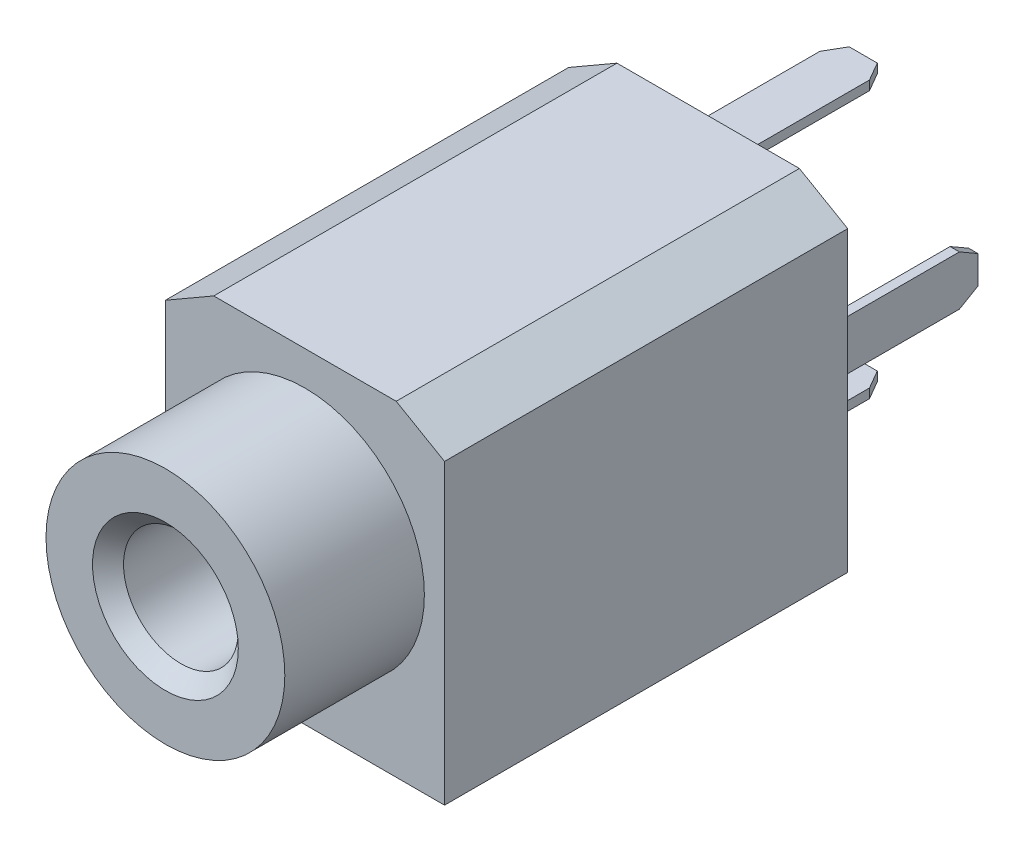
ISO-10303-21;
HEADER;
FILE_DESCRIPTION(('STEP AP214'),'2;1');
FILE_NAME('part.step','',(''),(''),'','','');
FILE_SCHEMA(('AUTOMOTIVE_DESIGN { 1 0 10303 214 1 1 1 1 }'));
ENDSEC;
DATA;
#1=APPLICATION_CONTEXT('core data for automotive mechanical design processes');
#2=APPLICATION_PROTOCOL_DEFINITION('international standard','automotive_design',2000,#1);
#3=PRODUCT_CONTEXT('',#1,'mechanical');
#4=PRODUCT('Part','Part','',(#3));
#5=PRODUCT_RELATED_PRODUCT_CATEGORY('part','',(#4));
#6=PRODUCT_DEFINITION_FORMATION('','',#4);
#7=PRODUCT_DEFINITION_CONTEXT('part definition',#1,'design');
#8=PRODUCT_DEFINITION('design','',#6,#7);
#9=PRODUCT_DEFINITION_SHAPE('','',#8);
#10=(LENGTH_UNIT() NAMED_UNIT(*) SI_UNIT(.MILLI.,.METRE.));
#11=(NAMED_UNIT(*) PLANE_ANGLE_UNIT() SI_UNIT($,.RADIAN.));
#12=(NAMED_UNIT(*) SI_UNIT($,.STERADIAN.) SOLID_ANGLE_UNIT());
#13=UNCERTAINTY_MEASURE_WITH_UNIT(LENGTH_MEASURE(1.E-05),#10,'distance_accuracy_value','');
#14=(GEOMETRIC_REPRESENTATION_CONTEXT(3) GLOBAL_UNCERTAINTY_ASSIGNED_CONTEXT((#13)) GLOBAL_UNIT_ASSIGNED_CONTEXT((#10,
#11,#12)) REPRESENTATION_CONTEXT('',''));
#15=CARTESIAN_POINT('',(0.,0.,0.));
#16=DIRECTION('',(0.,0.,1.));
#17=DIRECTION('',(1.,0.,0.));
#18=AXIS2_PLACEMENT_3D('',#15,#16,#17);
#19=CARTESIAN_POINT('',(0.,0.,-13.));
#20=DIRECTION('',(0.,0.,-1.));
#21=DIRECTION('',(-1.,0.,0.));
#22=AXIS2_PLACEMENT_3D('',#19,#20,#21);
#23=PLANE('',#22);
#24=CARTESIAN_POINT('',(0.,0.,-13.));
#25=DIRECTION('',(0.,0.,-1.));
#26=DIRECTION('',(-1.,0.,0.));
#27=AXIS2_PLACEMENT_3D('',#24,#25,#26);
#28=CIRCLE('',#27,1.85);
#29=CARTESIAN_POINT('',(-1.85,0.,-13.));
#30=VERTEX_POINT('',#29);
#31=EDGE_CURVE('E253',#30,#30,#28,.F.);
#32=ORIENTED_EDGE('',*,*,#31,.T.);
#33=EDGE_LOOP('',(#32));
#34=FACE_BOUND('',#33,.T.);
#35=DIRECTION('',(1.,0.,0.));
#36=VECTOR('',#35,1.);
#37=CARTESIAN_POINT('',(4.5,4.95,-13.));
#38=LINE('',#37,#36);
#39=CARTESIAN_POINT('',(-2.94115427318801,4.95,-13.));
#40=VERTEX_POINT('',#39);
#41=CARTESIAN_POINT('',(2.94115427318801,4.95,-13.));
#42=VERTEX_POINT('',#41);
#43=EDGE_CURVE('E350',#40,#42,#38,.T.);
#44=ORIENTED_EDGE('',*,*,#43,.T.);
#45=DIRECTION('',(-0.866025403784438,0.500000000000001,0.));
#46=VECTOR('',#45,1.);
#47=CARTESIAN_POINT('',(2.87870144266349,4.98605715851498,-13.));
#48=LINE('',#47,#46);
#49=CARTESIAN_POINT('',(4.5,4.05,-13.));
#50=VERTEX_POINT('',#49);
#51=EDGE_CURVE('E392',#42,#50,#48,.F.);
#52=ORIENTED_EDGE('',*,*,#51,.T.);
#53=DIRECTION('',(0.,-1.,0.));
#54=VECTOR('',#53,1.);
#55=CARTESIAN_POINT('',(4.5,4.95,-13.));
#56=LINE('',#55,#54);
#57=CARTESIAN_POINT('',(4.5,-5.55,-13.));
#58=VERTEX_POINT('',#57);
#59=EDGE_CURVE('E354',#50,#58,#56,.T.);
#60=ORIENTED_EDGE('',*,*,#59,.T.);
#61=DIRECTION('',(-1.,0.,0.));
#62=VECTOR('',#61,1.);
#63=CARTESIAN_POINT('',(4.5,-5.55,-13.));
#64=LINE('',#63,#62);
#65=CARTESIAN_POINT('',(-4.5,-5.55,-13.));
#66=VERTEX_POINT('',#65);
#67=EDGE_CURVE('E356',#58,#66,#64,.T.);
#68=ORIENTED_EDGE('',*,*,#67,.T.);
#69=DIRECTION('',(0.,1.,0.));
#70=VECTOR('',#69,1.);
#71=CARTESIAN_POINT('',(-4.5,4.95,-13.));
#72=LINE('',#71,#70);
#73=CARTESIAN_POINT('',(-4.5,4.05,-13.));
#74=VERTEX_POINT('',#73);
#75=EDGE_CURVE('E347',#66,#74,#72,.T.);
#76=ORIENTED_EDGE('',*,*,#75,.T.);
#77=DIRECTION('',(-0.866025403784438,-0.500000000000001,0.));
#78=VECTOR('',#77,1.);
#79=CARTESIAN_POINT('',(-2.87870144266349,4.98605715851499,-13.));
#80=LINE('',#79,#78);
#81=EDGE_CURVE('E390',#74,#40,#80,.F.);
#82=ORIENTED_EDGE('',*,*,#81,.T.);
#83=EDGE_LOOP('',(#44,#52,#60,#68,#76,#82));
#84=FACE_BOUND('',#83,.T.);
#85=DIRECTION('',(-1.,0.,0.));
#86=VECTOR('',#85,1.);
#87=CARTESIAN_POINT('',(0.8,3.85,-13.));
#88=LINE('',#87,#86);
#89=CARTESIAN_POINT('',(0.8,3.85,-13.));
#90=VERTEX_POINT('',#89);
#91=CARTESIAN_POINT('',(-0.800000000000002,3.85,-13.));
#92=VERTEX_POINT('',#91);
#93=EDGE_CURVE('E331',#90,#92,#88,.T.);
#94=ORIENTED_EDGE('',*,*,#93,.F.);
#95=DIRECTION('',(0.,-1.,0.));
#96=VECTOR('',#95,1.);
#97=CARTESIAN_POINT('',(0.8,4.15,-13.));
#98=LINE('',#97,#96);
#99=CARTESIAN_POINT('',(0.8,4.15,-13.));
#100=VERTEX_POINT('',#99);
#101=EDGE_CURVE('E320',#100,#90,#98,.T.);
#102=ORIENTED_EDGE('',*,*,#101,.F.);
#103=DIRECTION('',(1.,0.,0.));
#104=VECTOR('',#103,1.);
#105=CARTESIAN_POINT('',(0.8,4.15,-13.));
#106=LINE('',#105,#104);
#107=CARTESIAN_POINT('',(-0.8,4.15,-13.));
#108=VERTEX_POINT('',#107);
#109=EDGE_CURVE('E325',#108,#100,#106,.T.);
#110=ORIENTED_EDGE('',*,*,#109,.F.);
#111=DIRECTION('',(0.,1.,0.));
#112=VECTOR('',#111,1.);
#113=CARTESIAN_POINT('',(-0.8,4.15,-13.));
#114=LINE('',#113,#112);
#115=EDGE_CURVE('E334',#92,#108,#114,.T.);
#116=ORIENTED_EDGE('',*,*,#115,.F.);
#117=EDGE_LOOP('',(#94,#102,#110,#116));
#118=FACE_BOUND('',#117,.T.);
#119=DIRECTION('',(-1.,0.,0.));
#120=VECTOR('',#119,1.);
#121=CARTESIAN_POINT('',(-3.4,-0.8,-13.));
#122=LINE('',#121,#120);
#123=CARTESIAN_POINT('',(-3.4,-0.8,-13.));
#124=VERTEX_POINT('',#123);
#125=CARTESIAN_POINT('',(-3.7,-0.8,-13.));
#126=VERTEX_POINT('',#125);
#127=EDGE_CURVE('E305',#124,#126,#122,.T.);
#128=ORIENTED_EDGE('',*,*,#127,.F.);
#129=DIRECTION('',(0.,-1.,0.));
#130=VECTOR('',#129,1.);
#131=CARTESIAN_POINT('',(-3.4,0.8,-13.));
#132=LINE('',#131,#130);
#133=CARTESIAN_POINT('',(-3.4,0.8,-13.));
#134=VERTEX_POINT('',#133);
#135=EDGE_CURVE('E294',#134,#124,#132,.T.);
#136=ORIENTED_EDGE('',*,*,#135,.F.);
#137=DIRECTION('',(1.,0.,0.));
#138=VECTOR('',#137,1.);
#139=CARTESIAN_POINT('',(-3.4,0.8,-13.));
#140=LINE('',#139,#138);
#141=CARTESIAN_POINT('',(-3.7,0.8,-13.));
#142=VERTEX_POINT('',#141);
#143=EDGE_CURVE('E299',#142,#134,#140,.T.);
#144=ORIENTED_EDGE('',*,*,#143,.F.);
#145=DIRECTION('',(0.,1.,0.));
#146=VECTOR('',#145,1.);
#147=CARTESIAN_POINT('',(-3.7,0.8,-13.));
#148=LINE('',#147,#146);
#149=EDGE_CURVE('E308',#126,#142,#148,.T.);
#150=ORIENTED_EDGE('',*,*,#149,.F.);
#151=EDGE_LOOP('',(#128,#136,#144,#150));
#152=FACE_BOUND('',#151,.T.);
#153=DIRECTION('',(-1.,0.,0.));
#154=VECTOR('',#153,1.);
#155=CARTESIAN_POINT('',(3.7,-0.8,-13.));
#156=LINE('',#155,#154);
#157=CARTESIAN_POINT('',(3.7,-0.8,-13.));
#158=VERTEX_POINT('',#157);
#159=CARTESIAN_POINT('',(3.4,-0.8,-13.));
#160=VERTEX_POINT('',#159);
#161=EDGE_CURVE('E279',#158,#160,#156,.T.);
#162=ORIENTED_EDGE('',*,*,#161,.F.);
#163=DIRECTION('',(0.,-1.,0.));
#164=VECTOR('',#163,1.);
#165=CARTESIAN_POINT('',(3.7,0.8,-13.));
#166=LINE('',#165,#164);
#167=CARTESIAN_POINT('',(3.7,0.8,-13.));
#168=VERTEX_POINT('',#167);
#169=EDGE_CURVE('E242',#168,#158,#166,.T.);
#170=ORIENTED_EDGE('',*,*,#169,.F.);
#171=DIRECTION('',(1.,0.,0.));
#172=VECTOR('',#171,1.);
#173=CARTESIAN_POINT('',(3.7,0.8,-13.));
#174=LINE('',#173,#172);
#175=CARTESIAN_POINT('',(3.4,0.8,-13.));
#176=VERTEX_POINT('',#175);
#177=EDGE_CURVE('E273',#176,#168,#174,.T.);
#178=ORIENTED_EDGE('',*,*,#177,.F.);
#179=DIRECTION('',(0.,1.,0.));
#180=VECTOR('',#179,1.);
#181=CARTESIAN_POINT('',(3.4,0.8,-13.));
#182=LINE('',#181,#180);
#183=EDGE_CURVE('E282',#160,#176,#182,.T.);
#184=ORIENTED_EDGE('',*,*,#183,.F.);
#185=EDGE_LOOP('',(#162,#170,#178,#184));
#186=FACE_BOUND('',#185,.T.);
#187=DIRECTION('',(-1.,0.,0.));
#188=VECTOR('',#187,1.);
#189=CARTESIAN_POINT('',(0.799999999999999,-4.75,-13.));
#190=LINE('',#189,#188);
#191=CARTESIAN_POINT('',(0.799999999999999,-4.75,-13.));
#192=VERTEX_POINT('',#191);
#193=CARTESIAN_POINT('',(-0.800000000000001,-4.75,-13.));
#194=VERTEX_POINT('',#193);
#195=EDGE_CURVE('E237',#192,#194,#190,.T.);
#196=ORIENTED_EDGE('',*,*,#195,.F.);
#197=DIRECTION('',(0.,-1.,0.));
#198=VECTOR('',#197,1.);
#199=CARTESIAN_POINT('',(0.799999999999999,-4.45,-13.));
#200=LINE('',#199,#198);
#201=CARTESIAN_POINT('',(0.799999999999999,-4.45,-13.));
#202=VERTEX_POINT('',#201);
#203=EDGE_CURVE('E246',#202,#192,#200,.T.);
#204=ORIENTED_EDGE('',*,*,#203,.F.);
#205=DIRECTION('',(1.,0.,0.));
#206=VECTOR('',#205,1.);
#207=CARTESIAN_POINT('',(0.799999999999999,-4.45,-13.));
#208=LINE('',#207,#206);
#209=CARTESIAN_POINT('',(-0.800000000000001,-4.45,-13.));
#210=VERTEX_POINT('',#209);
#211=EDGE_CURVE('E258',#210,#202,#208,.T.);
#212=ORIENTED_EDGE('',*,*,#211,.F.);
#213=DIRECTION('',(0.,1.,0.));
#214=VECTOR('',#213,1.);
#215=CARTESIAN_POINT('',(-0.800000000000001,-4.45,-13.));
#216=LINE('',#215,#214);
#217=EDGE_CURVE('E256',#194,#210,#216,.T.);
#218=ORIENTED_EDGE('',*,*,#217,.F.);
#219=EDGE_LOOP('',(#196,#204,#212,#218));
#220=FACE_BOUND('',#219,.T.);
#221=ADVANCED_FACE('F33',(#34,#84,#118,#152,#186,#220),#23,.T.);
#222=CARTESIAN_POINT('',(0.,0.,4.5));
#223=DIRECTION('',(0.,0.,-1.));
#224=DIRECTION('',(-1.,0.,0.));
#225=AXIS2_PLACEMENT_3D('',#222,#223,#224);
#226=CYLINDRICAL_SURFACE('',#225,3.85);
#227=CARTESIAN_POINT('',(0.,0.,4.5));
#228=DIRECTION('',(0.,0.,1.));
#229=DIRECTION('',(1.,0.,0.));
#230=AXIS2_PLACEMENT_3D('',#227,#228,#229);
#231=CIRCLE('',#230,3.85);
#232=CARTESIAN_POINT('',(3.85,0.,4.5));
#233=VERTEX_POINT('',#232);
#234=EDGE_CURVE('E373',#233,#233,#231,.T.);
#235=ORIENTED_EDGE('',*,*,#234,.F.);
#236=EDGE_LOOP('',(#235));
#237=FACE_BOUND('',#236,.T.);
#238=CARTESIAN_POINT('',(0.,0.,0.));
#239=DIRECTION('',(0.,0.,1.));
#240=DIRECTION('',(1.,0.,0.));
#241=AXIS2_PLACEMENT_3D('',#238,#239,#240);
#242=CIRCLE('',#241,3.85);
#243=CARTESIAN_POINT('',(3.85,0.,0.));
#244=VERTEX_POINT('',#243);
#245=EDGE_CURVE('E372',#244,#244,#242,.T.);
#246=ORIENTED_EDGE('',*,*,#245,.T.);
#247=EDGE_LOOP('',(#246));
#248=FACE_BOUND('',#247,.T.);
#249=ADVANCED_FACE('F479',(#237,#248),#226,.T.);
#250=CARTESIAN_POINT('',(0.,0.,4.5));
#251=DIRECTION('',(0.,0.,1.));
#252=DIRECTION('',(1.,0.,0.));
#253=AXIS2_PLACEMENT_3D('',#250,#251,#252);
#254=PLANE('',#253);
#255=CARTESIAN_POINT('',(0.,0.,4.5));
#256=DIRECTION('',(0.,0.,1.));
#257=DIRECTION('',(1.,0.,0.));
#258=AXIS2_PLACEMENT_3D('',#255,#256,#257);
#259=CIRCLE('',#258,2.35000000000001);
#260=CARTESIAN_POINT('',(2.35000000000001,0.,4.5));
#261=VERTEX_POINT('',#260);
#262=EDGE_CURVE('E11',#261,#261,#259,.F.);
#263=ORIENTED_EDGE('',*,*,#262,.T.);
#264=EDGE_LOOP('',(#263));
#265=FACE_BOUND('',#264,.T.);
#266=ORIENTED_EDGE('',*,*,#234,.T.);
#267=EDGE_LOOP('',(#266));
#268=FACE_BOUND('',#267,.T.);
#269=ADVANCED_FACE('F485',(#265,#268),#254,.T.);
#270=CARTESIAN_POINT('',(-4.5,4.95,-13.));
#271=DIRECTION('',(1.,0.,0.));
#272=DIRECTION('',(0.,1.,0.));
#273=AXIS2_PLACEMENT_3D('',#270,#271,#272);
#274=PLANE('',#273);
#275=DIRECTION('',(0.,1.,0.));
#276=VECTOR('',#275,1.);
#277=CARTESIAN_POINT('',(-4.5,4.95,0.));
#278=LINE('',#277,#276);
#279=CARTESIAN_POINT('',(-4.5,-5.55,0.));
#280=VERTEX_POINT('',#279);
#281=CARTESIAN_POINT('',(-4.5,4.05,0.));
#282=VERTEX_POINT('',#281);
#283=EDGE_CURVE('E346',#280,#282,#278,.T.);
#284=ORIENTED_EDGE('',*,*,#283,.T.);
#285=DIRECTION('',(0.,0.,-1.));
#286=VECTOR('',#285,1.);
#287=CARTESIAN_POINT('',(-4.5,4.05,-13.));
#288=LINE('',#287,#286);
#289=EDGE_CURVE('E394',#282,#74,#288,.T.);
#290=ORIENTED_EDGE('',*,*,#289,.T.);
#291=ORIENTED_EDGE('',*,*,#75,.F.);
#292=DIRECTION('',(0.,0.,1.));
#293=VECTOR('',#292,1.);
#294=CARTESIAN_POINT('',(-4.5,-5.55,-13.));
#295=LINE('',#294,#293);
#296=EDGE_CURVE('E358',#66,#280,#295,.T.);
#297=ORIENTED_EDGE('',*,*,#296,.T.);
#298=EDGE_LOOP('',(#284,#290,#291,#297));
#299=FACE_BOUND('',#298,.T.);
#300=ADVANCED_FACE('F510',(#299),#274,.F.);
#301=CARTESIAN_POINT('',(4.5,4.95,-13.));
#302=DIRECTION('',(0.,-1.,0.));
#303=DIRECTION('',(1.,0.,0.));
#304=AXIS2_PLACEMENT_3D('',#301,#302,#303);
#305=PLANE('',#304);
#306=DIRECTION('',(1.,0.,0.));
#307=VECTOR('',#306,1.);
#308=CARTESIAN_POINT('',(4.5,4.95,0.));
#309=LINE('',#308,#307);
#310=CARTESIAN_POINT('',(-2.94115427318801,4.95,0.));
#311=VERTEX_POINT('',#310);
#312=CARTESIAN_POINT('',(2.94115427318801,4.95,0.));
#313=VERTEX_POINT('',#312);
#314=EDGE_CURVE('E361',#311,#313,#309,.T.);
#315=ORIENTED_EDGE('',*,*,#314,.T.);
#316=DIRECTION('',(0.,0.,-1.));
#317=VECTOR('',#316,1.);
#318=CARTESIAN_POINT('',(2.94115427318801,4.95,-13.));
#319=LINE('',#318,#317);
#320=EDGE_CURVE('E388',#313,#42,#319,.T.);
#321=ORIENTED_EDGE('',*,*,#320,.T.);
#322=ORIENTED_EDGE('',*,*,#43,.F.);
#323=DIRECTION('',(0.,0.,1.));
#324=VECTOR('',#323,1.);
#325=CARTESIAN_POINT('',(-2.94115427318801,4.95,-13.));
#326=LINE('',#325,#324);
#327=EDGE_CURVE('E385',#40,#311,#326,.T.);
#328=ORIENTED_EDGE('',*,*,#327,.T.);
#329=EDGE_LOOP('',(#315,#321,#322,#328));
#330=FACE_BOUND('',#329,.T.);
#331=ADVANCED_FACE('F506',(#330),#305,.F.);
#332=CARTESIAN_POINT('',(4.5,4.95,-13.));
#333=DIRECTION('',(-1.,0.,0.));
#334=DIRECTION('',(0.,-1.,0.));
#335=AXIS2_PLACEMENT_3D('',#332,#333,#334);
#336=PLANE('',#335);
#337=ORIENTED_EDGE('',*,*,#59,.F.);
#338=DIRECTION('',(0.,0.,1.));
#339=VECTOR('',#338,1.);
#340=CARTESIAN_POINT('',(4.5,4.05,-13.));
#341=LINE('',#340,#339);
#342=CARTESIAN_POINT('',(4.5,4.05,0.));
#343=VERTEX_POINT('',#342);
#344=EDGE_CURVE('E376',#50,#343,#341,.T.);
#345=ORIENTED_EDGE('',*,*,#344,.T.);
#346=DIRECTION('',(0.,-1.,0.));
#347=VECTOR('',#346,1.);
#348=CARTESIAN_POINT('',(4.5,4.95,0.));
#349=LINE('',#348,#347);
#350=CARTESIAN_POINT('',(4.5,-5.55,0.));
#351=VERTEX_POINT('',#350);
#352=EDGE_CURVE('E364',#343,#351,#349,.T.);
#353=ORIENTED_EDGE('',*,*,#352,.T.);
#354=DIRECTION('',(0.,0.,1.));
#355=VECTOR('',#354,1.);
#356=CARTESIAN_POINT('',(4.5,-5.55,-13.));
#357=LINE('',#356,#355);
#358=EDGE_CURVE('E369',#58,#351,#357,.T.);
#359=ORIENTED_EDGE('',*,*,#358,.F.);
#360=EDGE_LOOP('',(#337,#345,#353,#359));
#361=FACE_BOUND('',#360,.T.);
#362=ADVANCED_FACE('F502',(#361),#336,.F.);
#363=CARTESIAN_POINT('',(4.5,-5.55,-13.));
#364=DIRECTION('',(0.,1.,0.));
#365=DIRECTION('',(-1.,0.,0.));
#366=AXIS2_PLACEMENT_3D('',#363,#364,#365);
#367=PLANE('',#366);
#368=DIRECTION('',(-1.,0.,0.));
#369=VECTOR('',#368,1.);
#370=CARTESIAN_POINT('',(4.5,-5.55,0.));
#371=LINE('',#370,#369);
#372=EDGE_CURVE('E351',#351,#280,#371,.T.);
#373=ORIENTED_EDGE('',*,*,#372,.T.);
#374=ORIENTED_EDGE('',*,*,#296,.F.);
#375=ORIENTED_EDGE('',*,*,#67,.F.);
#376=ORIENTED_EDGE('',*,*,#358,.T.);
#377=EDGE_LOOP('',(#373,#374,#375,#376));
#378=FACE_BOUND('',#377,.T.);
#379=ADVANCED_FACE('F498',(#378),#367,.F.);
#380=CARTESIAN_POINT('',(0.,0.,0.));
#381=DIRECTION('',(0.,0.,-1.));
#382=DIRECTION('',(-1.,0.,0.));
#383=AXIS2_PLACEMENT_3D('',#380,#381,#382);
#384=PLANE('',#383);
#385=ORIENTED_EDGE('',*,*,#245,.F.);
#386=EDGE_LOOP('',(#385));
#387=FACE_BOUND('',#386,.T.);
#388=ORIENTED_EDGE('',*,*,#352,.F.);
#389=DIRECTION('',(0.866025403784438,-0.500000000000001,0.));
#390=VECTOR('',#389,1.);
#391=CARTESIAN_POINT('',(4.5,4.05,0.));
#392=LINE('',#391,#390);
#393=EDGE_CURVE('E383',#343,#313,#392,.F.);
#394=ORIENTED_EDGE('',*,*,#393,.T.);
#395=ORIENTED_EDGE('',*,*,#314,.F.);
#396=DIRECTION('',(0.866025403784438,0.500000000000001,0.));
#397=VECTOR('',#396,1.);
#398=CARTESIAN_POINT('',(-2.94115427318801,4.95,0.));
#399=LINE('',#398,#397);
#400=EDGE_CURVE('E381',#311,#282,#399,.F.);
#401=ORIENTED_EDGE('',*,*,#400,.T.);
#402=ORIENTED_EDGE('',*,*,#283,.F.);
#403=ORIENTED_EDGE('',*,*,#372,.F.);
#404=EDGE_LOOP('',(#388,#394,#395,#401,#402,#403));
#405=FACE_BOUND('',#404,.T.);
#406=ADVANCED_FACE('F494',(#387,#405),#384,.F.);
#407=CARTESIAN_POINT('',(4.5,4.05,-13.));
#408=DIRECTION('',(-0.500000000000001,-0.866025403784438,0.));
#409=DIRECTION('',(0.,0.,1.));
#410=AXIS2_PLACEMENT_3D('',#407,#408,#409);
#411=PLANE('',#410);
#412=ORIENTED_EDGE('',*,*,#51,.F.);
#413=ORIENTED_EDGE('',*,*,#320,.F.);
#414=ORIENTED_EDGE('',*,*,#393,.F.);
#415=ORIENTED_EDGE('',*,*,#344,.F.);
#416=EDGE_LOOP('',(#412,#413,#414,#415));
#417=FACE_BOUND('',#416,.T.);
#418=ADVANCED_FACE('F497',(#417),#411,.F.);
#419=CARTESIAN_POINT('',(-2.94115427318801,4.95,-13.));
#420=DIRECTION('',(0.500000000000001,-0.866025403784438,0.));
#421=DIRECTION('',(0.,0.,1.));
#422=AXIS2_PLACEMENT_3D('',#419,#420,#421);
#423=PLANE('',#422);
#424=ORIENTED_EDGE('',*,*,#81,.F.);
#425=ORIENTED_EDGE('',*,*,#289,.F.);
#426=ORIENTED_EDGE('',*,*,#400,.F.);
#427=ORIENTED_EDGE('',*,*,#327,.F.);
#428=EDGE_LOOP('',(#424,#425,#426,#427));
#429=FACE_BOUND('',#428,.T.);
#430=ADVANCED_FACE('F520',(#429),#423,.F.);
#431=CARTESIAN_POINT('',(0.8,4.15,-18.));
#432=DIRECTION('',(-1.,0.,0.));
#433=DIRECTION('',(0.,-1.,0.));
#434=AXIS2_PLACEMENT_3D('',#431,#432,#433);
#435=PLANE('',#434);
#436=DIRECTION('',(0.,0.,1.));
#437=VECTOR('',#436,1.);
#438=CARTESIAN_POINT('',(0.8,3.85,-18.));
#439=LINE('',#438,#437);
#440=CARTESIAN_POINT('',(0.8,3.85,-17.4));
#441=VERTEX_POINT('',#440);
#442=EDGE_CURVE('E344',#441,#90,#439,.T.);
#443=ORIENTED_EDGE('',*,*,#442,.F.);
#444=DIRECTION('',(0.,1.,0.));
#445=VECTOR('',#444,1.);
#446=CARTESIAN_POINT('',(0.8,4.15,-17.4));
#447=LINE('',#446,#445);
#448=CARTESIAN_POINT('',(0.8,4.15,-17.4));
#449=VERTEX_POINT('',#448);
#450=EDGE_CURVE('E406',#441,#449,#447,.T.);
#451=ORIENTED_EDGE('',*,*,#450,.T.);
#452=DIRECTION('',(0.,0.,1.));
#453=VECTOR('',#452,1.);
#454=CARTESIAN_POINT('',(0.8,4.15,-18.));
#455=LINE('',#454,#453);
#456=EDGE_CURVE('E328',#449,#100,#455,.T.);
#457=ORIENTED_EDGE('',*,*,#456,.T.);
#458=ORIENTED_EDGE('',*,*,#101,.T.);
#459=EDGE_LOOP('',(#443,#451,#457,#458));
#460=FACE_BOUND('',#459,.T.);
#461=ADVANCED_FACE('F492',(#460),#435,.F.);
#462=CARTESIAN_POINT('',(0.8,3.85,-18.));
#463=DIRECTION('',(0.,1.,0.));
#464=DIRECTION('',(0.,0.,1.));
#465=AXIS2_PLACEMENT_3D('',#462,#463,#464);
#466=PLANE('',#465);
#467=DIRECTION('',(-1.,0.,0.));
#468=VECTOR('',#467,1.);
#469=CARTESIAN_POINT('',(0.8,3.85,-18.));
#470=LINE('',#469,#468);
#471=CARTESIAN_POINT('',(0.453589838486222,3.85,-18.));
#472=VERTEX_POINT('',#471);
#473=CARTESIAN_POINT('',(-0.453589838486225,3.85,-18.));
#474=VERTEX_POINT('',#473);
#475=EDGE_CURVE('E321',#472,#474,#470,.T.);
#476=ORIENTED_EDGE('',*,*,#475,.F.);
#477=DIRECTION('',(0.499999999999999,0.,0.866025403784439));
#478=VECTOR('',#477,1.);
#479=CARTESIAN_POINT('',(0.453589838486221,3.85,-18.));
#480=LINE('',#479,#478);
#481=EDGE_CURVE('E404',#472,#441,#480,.T.);
#482=ORIENTED_EDGE('',*,*,#481,.T.);
#483=ORIENTED_EDGE('',*,*,#442,.T.);
#484=ORIENTED_EDGE('',*,*,#93,.T.);
#485=DIRECTION('',(0.,0.,1.));
#486=VECTOR('',#485,1.);
#487=CARTESIAN_POINT('',(-0.800000000000002,3.85,-18.));
#488=LINE('',#487,#486);
#489=CARTESIAN_POINT('',(-0.800000000000002,3.85,-17.4));
#490=VERTEX_POINT('',#489);
#491=EDGE_CURVE('E342',#490,#92,#488,.T.);
#492=ORIENTED_EDGE('',*,*,#491,.F.);
#493=DIRECTION('',(0.499999999999999,0.,-0.866025403784439));
#494=VECTOR('',#493,1.);
#495=CARTESIAN_POINT('',(-0.453589838486231,3.85,-18.));
#496=LINE('',#495,#494);
#497=EDGE_CURVE('E402',#490,#474,#496,.T.);
#498=ORIENTED_EDGE('',*,*,#497,.T.);
#499=EDGE_LOOP('',(#476,#482,#483,#484,#492,#498));
#500=FACE_BOUND('',#499,.T.);
#501=ADVANCED_FACE('F596',(#500),#466,.F.);
#502=CARTESIAN_POINT('',(-0.8,4.15,-18.));
#503=DIRECTION('',(1.,0.,0.));
#504=DIRECTION('',(0.,1.,0.));
#505=AXIS2_PLACEMENT_3D('',#502,#503,#504);
#506=PLANE('',#505);
#507=DIRECTION('',(0.,0.,1.));
#508=VECTOR('',#507,1.);
#509=CARTESIAN_POINT('',(-0.8,4.15,-18.));
#510=LINE('',#509,#508);
#511=CARTESIAN_POINT('',(-0.8,4.15,-17.4));
#512=VERTEX_POINT('',#511);
#513=EDGE_CURVE('E340',#512,#108,#510,.T.);
#514=ORIENTED_EDGE('',*,*,#513,.F.);
#515=DIRECTION('',(0.,-1.,0.));
#516=VECTOR('',#515,1.);
#517=CARTESIAN_POINT('',(-0.800000000000002,3.85,-17.4));
#518=LINE('',#517,#516);
#519=EDGE_CURVE('E412',#512,#490,#518,.T.);
#520=ORIENTED_EDGE('',*,*,#519,.T.);
#521=ORIENTED_EDGE('',*,*,#491,.T.);
#522=ORIENTED_EDGE('',*,*,#115,.T.);
#523=EDGE_LOOP('',(#514,#520,#521,#522));
#524=FACE_BOUND('',#523,.T.);
#525=ADVANCED_FACE('F593',(#524),#506,.F.);
#526=CARTESIAN_POINT('',(0.8,4.15,-18.));
#527=DIRECTION('',(0.,-1.,0.));
#528=DIRECTION('',(0.,0.,-1.));
#529=AXIS2_PLACEMENT_3D('',#526,#527,#528);
#530=PLANE('',#529);
#531=ORIENTED_EDGE('',*,*,#456,.F.);
#532=DIRECTION('',(-0.499999999999999,0.,-0.866025403784439));
#533=VECTOR('',#532,1.);
#534=CARTESIAN_POINT('',(0.453589838486221,4.15,-18.));
#535=LINE('',#534,#533);
#536=CARTESIAN_POINT('',(0.453589838486222,4.15,-18.));
#537=VERTEX_POINT('',#536);
#538=EDGE_CURVE('E410',#449,#537,#535,.T.);
#539=ORIENTED_EDGE('',*,*,#538,.T.);
#540=DIRECTION('',(1.,0.,0.));
#541=VECTOR('',#540,1.);
#542=CARTESIAN_POINT('',(0.8,4.15,-18.));
#543=LINE('',#542,#541);
#544=CARTESIAN_POINT('',(-0.453589838486223,4.15,-18.));
#545=VERTEX_POINT('',#544);
#546=EDGE_CURVE('E324',#545,#537,#543,.T.);
#547=ORIENTED_EDGE('',*,*,#546,.F.);
#548=DIRECTION('',(-0.499999999999999,0.,0.866025403784439));
#549=VECTOR('',#548,1.);
#550=CARTESIAN_POINT('',(-0.45358983848623,4.15,-18.));
#551=LINE('',#550,#549);
#552=EDGE_CURVE('E408',#545,#512,#551,.T.);
#553=ORIENTED_EDGE('',*,*,#552,.T.);
#554=ORIENTED_EDGE('',*,*,#513,.T.);
#555=ORIENTED_EDGE('',*,*,#109,.T.);
#556=EDGE_LOOP('',(#531,#539,#547,#553,#554,#555));
#557=FACE_BOUND('',#556,.T.);
#558=ADVANCED_FACE('F586',(#557),#530,.F.);
#559=CARTESIAN_POINT('',(0.,0.,-18.));
#560=DIRECTION('',(0.,0.,-1.));
#561=DIRECTION('',(-1.,0.,0.));
#562=AXIS2_PLACEMENT_3D('',#559,#560,#561);
#563=PLANE('',#562);
#564=ORIENTED_EDGE('',*,*,#546,.T.);
#565=DIRECTION('',(0.,-1.,0.));
#566=VECTOR('',#565,1.);
#567=CARTESIAN_POINT('',(0.453589838486222,3.85,-18.));
#568=LINE('',#567,#566);
#569=EDGE_CURVE('E399',#537,#472,#568,.T.);
#570=ORIENTED_EDGE('',*,*,#569,.T.);
#571=ORIENTED_EDGE('',*,*,#475,.T.);
#572=DIRECTION('',(0.,1.,0.));
#573=VECTOR('',#572,1.);
#574=CARTESIAN_POINT('',(-0.453589838486223,4.15,-18.));
#575=LINE('',#574,#573);
#576=EDGE_CURVE('E396',#474,#545,#575,.T.);
#577=ORIENTED_EDGE('',*,*,#576,.T.);
#578=EDGE_LOOP('',(#564,#570,#571,#577));
#579=FACE_BOUND('',#578,.T.);
#580=ADVANCED_FACE('F579',(#579),#563,.T.);
#581=CARTESIAN_POINT('',(-3.4,0.8,-18.));
#582=DIRECTION('',(-1.,0.,0.));
#583=DIRECTION('',(0.,0.,1.));
#584=AXIS2_PLACEMENT_3D('',#581,#582,#583);
#585=PLANE('',#584);
#586=DIRECTION('',(0.,0.,1.));
#587=VECTOR('',#586,1.);
#588=CARTESIAN_POINT('',(-3.4,-0.8,-18.));
#589=LINE('',#588,#587);
#590=CARTESIAN_POINT('',(-3.4,-0.8,-17.4));
#591=VERTEX_POINT('',#590);
#592=EDGE_CURVE('E318',#591,#124,#589,.T.);
#593=ORIENTED_EDGE('',*,*,#592,.F.);
#594=DIRECTION('',(0.,0.499999999999999,-0.866025403784439));
#595=VECTOR('',#594,1.);
#596=CARTESIAN_POINT('',(-3.4,-0.453589838486224,-18.));
#597=LINE('',#596,#595);
#598=CARTESIAN_POINT('',(-3.4,-0.453589838486224,-18.));
#599=VERTEX_POINT('',#598);
#600=EDGE_CURVE('E461',#591,#599,#597,.T.);
#601=ORIENTED_EDGE('',*,*,#600,.T.);
#602=DIRECTION('',(0.,-1.,0.));
#603=VECTOR('',#602,1.);
#604=CARTESIAN_POINT('',(-3.4,0.8,-18.));
#605=LINE('',#604,#603);
#606=CARTESIAN_POINT('',(-3.4,0.453589838486224,-18.));
#607=VERTEX_POINT('',#606);
#608=EDGE_CURVE('E295',#607,#599,#605,.T.);
#609=ORIENTED_EDGE('',*,*,#608,.F.);
#610=DIRECTION('',(0.,0.499999999999999,0.866025403784439));
#611=VECTOR('',#610,1.);
#612=CARTESIAN_POINT('',(-3.4,0.453589838486224,-18.));
#613=LINE('',#612,#611);
#614=CARTESIAN_POINT('',(-3.4,0.8,-17.4));
#615=VERTEX_POINT('',#614);
#616=EDGE_CURVE('E48',#607,#615,#613,.T.);
#617=ORIENTED_EDGE('',*,*,#616,.T.);
#618=DIRECTION('',(0.,0.,1.));
#619=VECTOR('',#618,1.);
#620=CARTESIAN_POINT('',(-3.4,0.8,-18.));
#621=LINE('',#620,#619);
#622=EDGE_CURVE('E302',#615,#134,#621,.T.);
#623=ORIENTED_EDGE('',*,*,#622,.T.);
#624=ORIENTED_EDGE('',*,*,#135,.T.);
#625=EDGE_LOOP('',(#593,#601,#609,#617,#623,#624));
#626=FACE_BOUND('',#625,.T.);
#627=ADVANCED_FACE('F577',(#626),#585,.F.);
#628=CARTESIAN_POINT('',(-3.4,-0.8,-18.));
#629=DIRECTION('',(0.,1.,0.));
#630=DIRECTION('',(-1.,0.,0.));
#631=AXIS2_PLACEMENT_3D('',#628,#629,#630);
#632=PLANE('',#631);
#633=DIRECTION('',(0.,0.,1.));
#634=VECTOR('',#633,1.);
#635=CARTESIAN_POINT('',(-3.7,-0.8,-18.));
#636=LINE('',#635,#634);
#637=CARTESIAN_POINT('',(-3.7,-0.8,-17.4));
#638=VERTEX_POINT('',#637);
#639=EDGE_CURVE('E316',#638,#126,#636,.T.);
#640=ORIENTED_EDGE('',*,*,#639,.F.);
#641=DIRECTION('',(1.,0.,0.));
#642=VECTOR('',#641,1.);
#643=CARTESIAN_POINT('',(-3.4,-0.8,-17.4));
#644=LINE('',#643,#642);
#645=EDGE_CURVE('E56',#638,#591,#644,.T.);
#646=ORIENTED_EDGE('',*,*,#645,.T.);
#647=ORIENTED_EDGE('',*,*,#592,.T.);
#648=ORIENTED_EDGE('',*,*,#127,.T.);
#649=EDGE_LOOP('',(#640,#646,#647,#648));
#650=FACE_BOUND('',#649,.T.);
#651=ADVANCED_FACE('F568',(#650),#632,.F.);
#652=CARTESIAN_POINT('',(-3.7,0.8,-18.));
#653=DIRECTION('',(1.,0.,0.));
#654=DIRECTION('',(0.,0.,-1.));
#655=AXIS2_PLACEMENT_3D('',#652,#653,#654);
#656=PLANE('',#655);
#657=DIRECTION('',(0.,1.,0.));
#658=VECTOR('',#657,1.);
#659=CARTESIAN_POINT('',(-3.7,0.8,-18.));
#660=LINE('',#659,#658);
#661=CARTESIAN_POINT('',(-3.7,-0.453589838486224,-18.));
#662=VERTEX_POINT('',#661);
#663=CARTESIAN_POINT('',(-3.7,0.453589838486224,-18.));
#664=VERTEX_POINT('',#663);
#665=EDGE_CURVE('E298',#662,#664,#660,.T.);
#666=ORIENTED_EDGE('',*,*,#665,.F.);
#667=DIRECTION('',(0.,-0.499999999999999,0.866025403784439));
#668=VECTOR('',#667,1.);
#669=CARTESIAN_POINT('',(-3.7,-0.453589838486224,-18.));
#670=LINE('',#669,#668);
#671=EDGE_CURVE('E457',#662,#638,#670,.T.);
#672=ORIENTED_EDGE('',*,*,#671,.T.);
#673=ORIENTED_EDGE('',*,*,#639,.T.);
#674=ORIENTED_EDGE('',*,*,#149,.T.);
#675=DIRECTION('',(0.,0.,1.));
#676=VECTOR('',#675,1.);
#677=CARTESIAN_POINT('',(-3.7,0.8,-18.));
#678=LINE('',#677,#676);
#679=CARTESIAN_POINT('',(-3.7,0.8,-17.4));
#680=VERTEX_POINT('',#679);
#681=EDGE_CURVE('E314',#680,#142,#678,.T.);
#682=ORIENTED_EDGE('',*,*,#681,.F.);
#683=DIRECTION('',(0.,-0.499999999999999,-0.866025403784439));
#684=VECTOR('',#683,1.);
#685=CARTESIAN_POINT('',(-3.7,0.453589838486224,-18.));
#686=LINE('',#685,#684);
#687=EDGE_CURVE('E455',#680,#664,#686,.T.);
#688=ORIENTED_EDGE('',*,*,#687,.T.);
#689=EDGE_LOOP('',(#666,#672,#673,#674,#682,#688));
#690=FACE_BOUND('',#689,.T.);
#691=ADVANCED_FACE('F563',(#690),#656,.F.);
#692=CARTESIAN_POINT('',(-3.4,0.8,-18.));
#693=DIRECTION('',(0.,-1.,0.));
#694=DIRECTION('',(1.,0.,0.));
#695=AXIS2_PLACEMENT_3D('',#692,#693,#694);
#696=PLANE('',#695);
#697=ORIENTED_EDGE('',*,*,#622,.F.);
#698=DIRECTION('',(-1.,0.,0.));
#699=VECTOR('',#698,1.);
#700=CARTESIAN_POINT('',(-3.7,0.8,-17.4));
#701=LINE('',#700,#699);
#702=EDGE_CURVE('E463',#615,#680,#701,.T.);
#703=ORIENTED_EDGE('',*,*,#702,.T.);
#704=ORIENTED_EDGE('',*,*,#681,.T.);
#705=ORIENTED_EDGE('',*,*,#143,.T.);
#706=EDGE_LOOP('',(#697,#703,#704,#705));
#707=FACE_BOUND('',#706,.T.);
#708=ADVANCED_FACE('F576',(#707),#696,.F.);
#709=CARTESIAN_POINT('',(0.,0.,-18.));
#710=DIRECTION('',(0.,0.,-1.));
#711=DIRECTION('',(-1.,0.,0.));
#712=AXIS2_PLACEMENT_3D('',#709,#710,#711);
#713=PLANE('',#712);
#714=ORIENTED_EDGE('',*,*,#608,.T.);
#715=DIRECTION('',(-1.,0.,0.));
#716=VECTOR('',#715,1.);
#717=CARTESIAN_POINT('',(-3.7,-0.453589838486224,-18.));
#718=LINE('',#717,#716);
#719=EDGE_CURVE('E452',#599,#662,#718,.T.);
#720=ORIENTED_EDGE('',*,*,#719,.T.);
#721=ORIENTED_EDGE('',*,*,#665,.T.);
#722=DIRECTION('',(1.,0.,0.));
#723=VECTOR('',#722,1.);
#724=CARTESIAN_POINT('',(-3.4,0.453589838486224,-18.));
#725=LINE('',#724,#723);
#726=EDGE_CURVE('E449',#664,#607,#725,.T.);
#727=ORIENTED_EDGE('',*,*,#726,.T.);
#728=EDGE_LOOP('',(#714,#720,#721,#727));
#729=FACE_BOUND('',#728,.T.);
#730=ADVANCED_FACE('F565',(#729),#713,.T.);
#731=CARTESIAN_POINT('',(3.7,0.8,-18.));
#732=DIRECTION('',(-1.,0.,0.));
#733=DIRECTION('',(0.,0.,1.));
#734=AXIS2_PLACEMENT_3D('',#731,#732,#733);
#735=PLANE('',#734);
#736=DIRECTION('',(0.,-1.,0.));
#737=VECTOR('',#736,1.);
#738=CARTESIAN_POINT('',(3.7,0.8,-18.));
#739=LINE('',#738,#737);
#740=CARTESIAN_POINT('',(3.7,0.453589838486224,-18.));
#741=VERTEX_POINT('',#740);
#742=CARTESIAN_POINT('',(3.7,-0.453589838486224,-18.));
#743=VERTEX_POINT('',#742);
#744=EDGE_CURVE('E269',#741,#743,#739,.T.);
#745=ORIENTED_EDGE('',*,*,#744,.F.);
#746=DIRECTION('',(0.,0.499999999999999,0.866025403784439));
#747=VECTOR('',#746,1.);
#748=CARTESIAN_POINT('',(3.7,0.453589838486224,-18.));
#749=LINE('',#748,#747);
#750=CARTESIAN_POINT('',(3.7,0.8,-17.4));
#751=VERTEX_POINT('',#750);
#752=EDGE_CURVE('E422',#741,#751,#749,.T.);
#753=ORIENTED_EDGE('',*,*,#752,.T.);
#754=DIRECTION('',(0.,0.,1.));
#755=VECTOR('',#754,1.);
#756=CARTESIAN_POINT('',(3.7,0.8,-18.));
#757=LINE('',#756,#755);
#758=EDGE_CURVE('E276',#751,#168,#757,.T.);
#759=ORIENTED_EDGE('',*,*,#758,.T.);
#760=ORIENTED_EDGE('',*,*,#169,.T.);
#761=DIRECTION('',(0.,0.,1.));
#762=VECTOR('',#761,1.);
#763=CARTESIAN_POINT('',(3.7,-0.8,-18.));
#764=LINE('',#763,#762);
#765=CARTESIAN_POINT('',(3.7,-0.8,-17.4));
#766=VERTEX_POINT('',#765);
#767=EDGE_CURVE('E292',#766,#158,#764,.T.);
#768=ORIENTED_EDGE('',*,*,#767,.F.);
#769=DIRECTION('',(0.,0.499999999999999,-0.866025403784439));
#770=VECTOR('',#769,1.);
#771=CARTESIAN_POINT('',(3.7,-0.453589838486224,-18.));
#772=LINE('',#771,#770);
#773=EDGE_CURVE('E420',#766,#743,#772,.T.);
#774=ORIENTED_EDGE('',*,*,#773,.T.);
#775=EDGE_LOOP('',(#745,#753,#759,#760,#768,#774));
#776=FACE_BOUND('',#775,.T.);
#777=ADVANCED_FACE('F733',(#776),#735,.F.);
#778=CARTESIAN_POINT('',(3.7,-0.8,-18.));
#779=DIRECTION('',(0.,1.,0.));
#780=DIRECTION('',(-1.,0.,0.));
#781=AXIS2_PLACEMENT_3D('',#778,#779,#780);
#782=PLANE('',#781);
#783=DIRECTION('',(0.,0.,1.));
#784=VECTOR('',#783,1.);
#785=CARTESIAN_POINT('',(3.4,-0.8,-18.));
#786=LINE('',#785,#784);
#787=CARTESIAN_POINT('',(3.4,-0.8,-17.4));
#788=VERTEX_POINT('',#787);
#789=EDGE_CURVE('E290',#788,#160,#786,.T.);
#790=ORIENTED_EDGE('',*,*,#789,.F.);
#791=DIRECTION('',(1.,0.,0.));
#792=VECTOR('',#791,1.);
#793=CARTESIAN_POINT('',(3.7,-0.8,-17.4));
#794=LINE('',#793,#792);
#795=EDGE_CURVE('E430',#788,#766,#794,.T.);
#796=ORIENTED_EDGE('',*,*,#795,.T.);
#797=ORIENTED_EDGE('',*,*,#767,.T.);
#798=ORIENTED_EDGE('',*,*,#161,.T.);
#799=EDGE_LOOP('',(#790,#796,#797,#798));
#800=FACE_BOUND('',#799,.T.);
#801=ADVANCED_FACE('F741',(#800),#782,.F.);
#802=CARTESIAN_POINT('',(3.4,0.8,-18.));
#803=DIRECTION('',(1.,0.,0.));
#804=DIRECTION('',(0.,0.,-1.));
#805=AXIS2_PLACEMENT_3D('',#802,#803,#804);
#806=PLANE('',#805);
#807=DIRECTION('',(0.,0.,1.));
#808=VECTOR('',#807,1.);
#809=CARTESIAN_POINT('',(3.4,0.8,-18.));
#810=LINE('',#809,#808);
#811=CARTESIAN_POINT('',(3.4,0.8,-17.4));
#812=VERTEX_POINT('',#811);
#813=EDGE_CURVE('E288',#812,#176,#810,.T.);
#814=ORIENTED_EDGE('',*,*,#813,.F.);
#815=DIRECTION('',(0.,-0.499999999999999,-0.866025403784439));
#816=VECTOR('',#815,1.);
#817=CARTESIAN_POINT('',(3.4,0.453589838486224,-18.));
#818=LINE('',#817,#816);
#819=CARTESIAN_POINT('',(3.4,0.453589838486224,-18.));
#820=VERTEX_POINT('',#819);
#821=EDGE_CURVE('E428',#812,#820,#818,.T.);
#822=ORIENTED_EDGE('',*,*,#821,.T.);
#823=DIRECTION('',(0.,1.,0.));
#824=VECTOR('',#823,1.);
#825=CARTESIAN_POINT('',(3.4,0.8,-18.));
#826=LINE('',#825,#824);
#827=CARTESIAN_POINT('',(3.4,-0.453589838486224,-18.));
#828=VERTEX_POINT('',#827);
#829=EDGE_CURVE('E272',#828,#820,#826,.T.);
#830=ORIENTED_EDGE('',*,*,#829,.F.);
#831=DIRECTION('',(0.,-0.499999999999999,0.866025403784439));
#832=VECTOR('',#831,1.);
#833=CARTESIAN_POINT('',(3.4,-0.453589838486224,-18.));
#834=LINE('',#833,#832);
#835=EDGE_CURVE('E426',#828,#788,#834,.T.);
#836=ORIENTED_EDGE('',*,*,#835,.T.);
#837=ORIENTED_EDGE('',*,*,#789,.T.);
#838=ORIENTED_EDGE('',*,*,#183,.T.);
#839=EDGE_LOOP('',(#814,#822,#830,#836,#837,#838));
#840=FACE_BOUND('',#839,.T.);
#841=ADVANCED_FACE('F750',(#840),#806,.F.);
#842=CARTESIAN_POINT('',(3.7,0.8,-18.));
#843=DIRECTION('',(0.,-1.,0.));
#844=DIRECTION('',(1.,0.,0.));
#845=AXIS2_PLACEMENT_3D('',#842,#843,#844);
#846=PLANE('',#845);
#847=ORIENTED_EDGE('',*,*,#758,.F.);
#848=DIRECTION('',(-1.,0.,0.));
#849=VECTOR('',#848,1.);
#850=CARTESIAN_POINT('',(3.4,0.8,-17.4));
#851=LINE('',#850,#849);
#852=EDGE_CURVE('E424',#751,#812,#851,.T.);
#853=ORIENTED_EDGE('',*,*,#852,.T.);
#854=ORIENTED_EDGE('',*,*,#813,.T.);
#855=ORIENTED_EDGE('',*,*,#177,.T.);
#856=EDGE_LOOP('',(#847,#853,#854,#855));
#857=FACE_BOUND('',#856,.T.);
#858=ADVANCED_FACE('F759',(#857),#846,.F.);
#859=CARTESIAN_POINT('',(0.,0.,-18.));
#860=DIRECTION('',(0.,0.,-1.));
#861=DIRECTION('',(-1.,0.,0.));
#862=AXIS2_PLACEMENT_3D('',#859,#860,#861);
#863=PLANE('',#862);
#864=ORIENTED_EDGE('',*,*,#829,.T.);
#865=DIRECTION('',(1.,0.,0.));
#866=VECTOR('',#865,1.);
#867=CARTESIAN_POINT('',(3.7,0.453589838486224,-18.));
#868=LINE('',#867,#866);
#869=EDGE_CURVE('E417',#820,#741,#868,.T.);
#870=ORIENTED_EDGE('',*,*,#869,.T.);
#871=ORIENTED_EDGE('',*,*,#744,.T.);
#872=DIRECTION('',(-1.,0.,0.));
#873=VECTOR('',#872,1.);
#874=CARTESIAN_POINT('',(3.4,-0.453589838486224,-18.));
#875=LINE('',#874,#873);
#876=EDGE_CURVE('E414',#743,#828,#875,.T.);
#877=ORIENTED_EDGE('',*,*,#876,.T.);
#878=EDGE_LOOP('',(#864,#870,#871,#877));
#879=FACE_BOUND('',#878,.T.);
#880=ADVANCED_FACE('F768',(#879),#863,.T.);
#881=CARTESIAN_POINT('',(0.799999999999999,-4.45,-18.));
#882=DIRECTION('',(-1.,0.,0.));
#883=DIRECTION('',(0.,-1.,0.));
#884=AXIS2_PLACEMENT_3D('',#881,#882,#883);
#885=PLANE('',#884);
#886=DIRECTION('',(0.,0.,1.));
#887=VECTOR('',#886,1.);
#888=CARTESIAN_POINT('',(0.799999999999999,-4.75,-18.));
#889=LINE('',#888,#887);
#890=CARTESIAN_POINT('',(0.799999999999999,-4.75,-17.4));
#891=VERTEX_POINT('',#890);
#892=EDGE_CURVE('E231',#891,#192,#889,.T.);
#893=ORIENTED_EDGE('',*,*,#892,.F.);
#894=DIRECTION('',(0.,1.,0.));
#895=VECTOR('',#894,1.);
#896=CARTESIAN_POINT('',(0.799999999999999,-4.45,-17.4));
#897=LINE('',#896,#895);
#898=CARTESIAN_POINT('',(0.799999999999999,-4.45,-17.4));
#899=VERTEX_POINT('',#898);
#900=EDGE_CURVE('E441',#891,#899,#897,.T.);
#901=ORIENTED_EDGE('',*,*,#900,.T.);
#902=DIRECTION('',(0.,0.,1.));
#903=VECTOR('',#902,1.);
#904=CARTESIAN_POINT('',(0.799999999999999,-4.45,-18.));
#905=LINE('',#904,#903);
#906=EDGE_CURVE('E249',#899,#202,#905,.T.);
#907=ORIENTED_EDGE('',*,*,#906,.T.);
#908=ORIENTED_EDGE('',*,*,#203,.T.);
#909=EDGE_LOOP('',(#893,#901,#907,#908));
#910=FACE_BOUND('',#909,.T.);
#911=ADVANCED_FACE('F247',(#910),#885,.F.);
#912=CARTESIAN_POINT('',(0.799999999999999,-4.75,-18.));
#913=DIRECTION('',(0.,1.,0.));
#914=DIRECTION('',(0.,0.,1.));
#915=AXIS2_PLACEMENT_3D('',#912,#913,#914);
#916=PLANE('',#915);
#917=DIRECTION('',(-1.,0.,0.));
#918=VECTOR('',#917,1.);
#919=CARTESIAN_POINT('',(0.799999999999999,-4.75,-18.));
#920=LINE('',#919,#918);
#921=CARTESIAN_POINT('',(0.453589838486223,-4.75,-18.));
#922=VERTEX_POINT('',#921);
#923=CARTESIAN_POINT('',(-0.453589838486225,-4.75,-18.));
#924=VERTEX_POINT('',#923);
#925=EDGE_CURVE('E263',#922,#924,#920,.T.);
#926=ORIENTED_EDGE('',*,*,#925,.F.);
#927=DIRECTION('',(0.499999999999999,0.,0.866025403784439));
#928=VECTOR('',#927,1.);
#929=CARTESIAN_POINT('',(0.453589838486223,-4.75,-18.));
#930=LINE('',#929,#928);
#931=EDGE_CURVE('E239',#922,#891,#930,.T.);
#932=ORIENTED_EDGE('',*,*,#931,.T.);
#933=ORIENTED_EDGE('',*,*,#892,.T.);
#934=ORIENTED_EDGE('',*,*,#195,.T.);
#935=DIRECTION('',(0.,0.,1.));
#936=VECTOR('',#935,1.);
#937=CARTESIAN_POINT('',(-0.800000000000001,-4.75,-18.));
#938=LINE('',#937,#936);
#939=CARTESIAN_POINT('',(-0.800000000000001,-4.75,-17.4));
#940=VERTEX_POINT('',#939);
#941=EDGE_CURVE('E243',#940,#194,#938,.T.);
#942=ORIENTED_EDGE('',*,*,#941,.F.);
#943=DIRECTION('',(0.499999999999999,0.,-0.866025403784439));
#944=VECTOR('',#943,1.);
#945=CARTESIAN_POINT('',(-0.453589838486224,-4.75,-18.));
#946=LINE('',#945,#944);
#947=EDGE_CURVE('E438',#940,#924,#946,.T.);
#948=ORIENTED_EDGE('',*,*,#947,.T.);
#949=EDGE_LOOP('',(#926,#932,#933,#934,#942,#948));
#950=FACE_BOUND('',#949,.T.);
#951=ADVANCED_FACE('F234',(#950),#916,.F.);
#952=CARTESIAN_POINT('',(-0.800000000000001,-4.45,-18.));
#953=DIRECTION('',(1.,0.,0.));
#954=DIRECTION('',(0.,1.,0.));
#955=AXIS2_PLACEMENT_3D('',#952,#953,#954);
#956=PLANE('',#955);
#957=DIRECTION('',(0.,0.,1.));
#958=VECTOR('',#957,1.);
#959=CARTESIAN_POINT('',(-0.800000000000001,-4.45,-18.));
#960=LINE('',#959,#958);
#961=CARTESIAN_POINT('',(-0.800000000000001,-4.45,-17.4));
#962=VERTEX_POINT('',#961);
#963=EDGE_CURVE('E265',#962,#210,#960,.T.);
#964=ORIENTED_EDGE('',*,*,#963,.F.);
#965=DIRECTION('',(0.,-1.,0.));
#966=VECTOR('',#965,1.);
#967=CARTESIAN_POINT('',(-0.800000000000001,-4.75,-17.4));
#968=LINE('',#967,#966);
#969=EDGE_CURVE('E447',#962,#940,#968,.T.);
#970=ORIENTED_EDGE('',*,*,#969,.T.);
#971=ORIENTED_EDGE('',*,*,#941,.T.);
#972=ORIENTED_EDGE('',*,*,#217,.T.);
#973=EDGE_LOOP('',(#964,#970,#971,#972));
#974=FACE_BOUND('',#973,.T.);
#975=ADVANCED_FACE('F792',(#974),#956,.F.);
#976=CARTESIAN_POINT('',(0.799999999999999,-4.45,-18.));
#977=DIRECTION('',(0.,-1.,0.));
#978=DIRECTION('',(0.,0.,-1.));
#979=AXIS2_PLACEMENT_3D('',#976,#977,#978);
#980=PLANE('',#979);
#981=ORIENTED_EDGE('',*,*,#906,.F.);
#982=DIRECTION('',(-0.499999999999999,0.,-0.866025403784439));
#983=VECTOR('',#982,1.);
#984=CARTESIAN_POINT('',(0.453589838486223,-4.45,-18.));
#985=LINE('',#984,#983);
#986=CARTESIAN_POINT('',(0.453589838486223,-4.45,-18.));
#987=VERTEX_POINT('',#986);
#988=EDGE_CURVE('E445',#899,#987,#985,.T.);
#989=ORIENTED_EDGE('',*,*,#988,.T.);
#990=DIRECTION('',(1.,0.,0.));
#991=VECTOR('',#990,1.);
#992=CARTESIAN_POINT('',(0.799999999999999,-4.45,-18.));
#993=LINE('',#992,#991);
#994=CARTESIAN_POINT('',(-0.453589838486225,-4.45,-18.));
#995=VERTEX_POINT('',#994);
#996=EDGE_CURVE('E266',#995,#987,#993,.T.);
#997=ORIENTED_EDGE('',*,*,#996,.F.);
#998=DIRECTION('',(-0.499999999999999,0.,0.866025403784439));
#999=VECTOR('',#998,1.);
#1000=CARTESIAN_POINT('',(-0.453589838486224,-4.45,-18.));
#1001=LINE('',#1000,#999);
#1002=EDGE_CURVE('E443',#995,#962,#1001,.T.);
#1003=ORIENTED_EDGE('',*,*,#1002,.T.);
#1004=ORIENTED_EDGE('',*,*,#963,.T.);
#1005=ORIENTED_EDGE('',*,*,#211,.T.);
#1006=EDGE_LOOP('',(#981,#989,#997,#1003,#1004,#1005));
#1007=FACE_BOUND('',#1006,.T.);
#1008=ADVANCED_FACE('F800',(#1007),#980,.F.);
#1009=CARTESIAN_POINT('',(0.,0.,-18.));
#1010=DIRECTION('',(0.,0.,-1.));
#1011=DIRECTION('',(-1.,0.,0.));
#1012=AXIS2_PLACEMENT_3D('',#1009,#1010,#1011);
#1013=PLANE('',#1012);
#1014=ORIENTED_EDGE('',*,*,#996,.T.);
#1015=DIRECTION('',(0.,-1.,0.));
#1016=VECTOR('',#1015,1.);
#1017=CARTESIAN_POINT('',(0.453589838486223,-4.75,-18.));
#1018=LINE('',#1017,#1016);
#1019=EDGE_CURVE('E435',#987,#922,#1018,.T.);
#1020=ORIENTED_EDGE('',*,*,#1019,.T.);
#1021=ORIENTED_EDGE('',*,*,#925,.T.);
#1022=DIRECTION('',(0.,1.,0.));
#1023=VECTOR('',#1022,1.);
#1024=CARTESIAN_POINT('',(-0.453589838486225,-4.45,-18.));
#1025=LINE('',#1024,#1023);
#1026=EDGE_CURVE('E432',#924,#995,#1025,.T.);
#1027=ORIENTED_EDGE('',*,*,#1026,.T.);
#1028=EDGE_LOOP('',(#1014,#1020,#1021,#1027));
#1029=FACE_BOUND('',#1028,.T.);
#1030=ADVANCED_FACE('F529',(#1029),#1013,.T.);
#1031=CARTESIAN_POINT('',(0.453589838486219,0.,-18.));
#1032=DIRECTION('',(0.866025403784439,0.,-0.499999999999999));
#1033=DIRECTION('',(0.,1.,0.));
#1034=AXIS2_PLACEMENT_3D('',#1031,#1032,#1033);
#1035=PLANE('',#1034);
#1036=ORIENTED_EDGE('',*,*,#538,.F.);
#1037=ORIENTED_EDGE('',*,*,#450,.F.);
#1038=ORIENTED_EDGE('',*,*,#481,.F.);
#1039=ORIENTED_EDGE('',*,*,#569,.F.);
#1040=EDGE_LOOP('',(#1036,#1037,#1038,#1039));
#1041=FACE_BOUND('',#1040,.T.);
#1042=ADVANCED_FACE('F525',(#1041),#1035,.T.);
#1043=CARTESIAN_POINT('',(-0.453589838486248,0.,-18.));
#1044=DIRECTION('',(-0.866025403784439,0.,-0.499999999999999));
#1045=DIRECTION('',(0.,-1.,0.));
#1046=AXIS2_PLACEMENT_3D('',#1043,#1044,#1045);
#1047=PLANE('',#1046);
#1048=ORIENTED_EDGE('',*,*,#497,.F.);
#1049=ORIENTED_EDGE('',*,*,#519,.F.);
#1050=ORIENTED_EDGE('',*,*,#552,.F.);
#1051=ORIENTED_EDGE('',*,*,#576,.F.);
#1052=EDGE_LOOP('',(#1048,#1049,#1050,#1051));
#1053=FACE_BOUND('',#1052,.T.);
#1054=ADVANCED_FACE('F528',(#1053),#1047,.T.);
#1055=CARTESIAN_POINT('',(0.,0.453589838486225,-18.));
#1056=DIRECTION('',(0.,0.866025403784439,-0.499999999999999));
#1057=DIRECTION('',(-1.,0.,0.));
#1058=AXIS2_PLACEMENT_3D('',#1055,#1056,#1057);
#1059=PLANE('',#1058);
#1060=ORIENTED_EDGE('',*,*,#821,.F.);
#1061=ORIENTED_EDGE('',*,*,#852,.F.);
#1062=ORIENTED_EDGE('',*,*,#752,.F.);
#1063=ORIENTED_EDGE('',*,*,#869,.F.);
#1064=EDGE_LOOP('',(#1060,#1061,#1062,#1063));
#1065=FACE_BOUND('',#1064,.T.);
#1066=ADVANCED_FACE('F533',(#1065),#1059,.T.);
#1067=CARTESIAN_POINT('',(0.,-0.453589838486225,-18.));
#1068=DIRECTION('',(0.,-0.866025403784439,-0.499999999999999));
#1069=DIRECTION('',(1.,0.,0.));
#1070=AXIS2_PLACEMENT_3D('',#1067,#1068,#1069);
#1071=PLANE('',#1070);
#1072=ORIENTED_EDGE('',*,*,#773,.F.);
#1073=ORIENTED_EDGE('',*,*,#795,.F.);
#1074=ORIENTED_EDGE('',*,*,#835,.F.);
#1075=ORIENTED_EDGE('',*,*,#876,.F.);
#1076=EDGE_LOOP('',(#1072,#1073,#1074,#1075));
#1077=FACE_BOUND('',#1076,.T.);
#1078=ADVANCED_FACE('F537',(#1077),#1071,.T.);
#1079=CARTESIAN_POINT('',(0.453589838486224,0.,-18.));
#1080=DIRECTION('',(0.866025403784439,0.,-0.499999999999999));
#1081=DIRECTION('',(0.,1.,0.));
#1082=AXIS2_PLACEMENT_3D('',#1079,#1080,#1081);
#1083=PLANE('',#1082);
#1084=ORIENTED_EDGE('',*,*,#988,.F.);
#1085=ORIENTED_EDGE('',*,*,#900,.F.);
#1086=ORIENTED_EDGE('',*,*,#931,.F.);
#1087=ORIENTED_EDGE('',*,*,#1019,.F.);
#1088=EDGE_LOOP('',(#1084,#1085,#1086,#1087));
#1089=FACE_BOUND('',#1088,.T.);
#1090=ADVANCED_FACE('F541',(#1089),#1083,.T.);
#1091=CARTESIAN_POINT('',(-0.453589838486223,0.,-18.));
#1092=DIRECTION('',(-0.866025403784439,0.,-0.499999999999999));
#1093=DIRECTION('',(0.,-1.,0.));
#1094=AXIS2_PLACEMENT_3D('',#1091,#1092,#1093);
#1095=PLANE('',#1094);
#1096=ORIENTED_EDGE('',*,*,#947,.F.);
#1097=ORIENTED_EDGE('',*,*,#969,.F.);
#1098=ORIENTED_EDGE('',*,*,#1002,.F.);
#1099=ORIENTED_EDGE('',*,*,#1026,.F.);
#1100=EDGE_LOOP('',(#1096,#1097,#1098,#1099));
#1101=FACE_BOUND('',#1100,.T.);
#1102=ADVANCED_FACE('F545',(#1101),#1095,.T.);
#1103=CARTESIAN_POINT('',(0.,-0.453589838486225,-18.));
#1104=DIRECTION('',(0.,-0.866025403784439,-0.499999999999999));
#1105=DIRECTION('',(1.,0.,0.));
#1106=AXIS2_PLACEMENT_3D('',#1103,#1104,#1105);
#1107=PLANE('',#1106);
#1108=ORIENTED_EDGE('',*,*,#600,.F.);
#1109=ORIENTED_EDGE('',*,*,#645,.F.);
#1110=ORIENTED_EDGE('',*,*,#671,.F.);
#1111=ORIENTED_EDGE('',*,*,#719,.F.);
#1112=EDGE_LOOP('',(#1108,#1109,#1110,#1111));
#1113=FACE_BOUND('',#1112,.T.);
#1114=ADVANCED_FACE('F549',(#1113),#1107,.T.);
#1115=CARTESIAN_POINT('',(0.,0.453589838486225,-18.));
#1116=DIRECTION('',(0.,0.866025403784439,-0.499999999999999));
#1117=DIRECTION('',(-1.,0.,0.));
#1118=AXIS2_PLACEMENT_3D('',#1115,#1116,#1117);
#1119=PLANE('',#1118);
#1120=ORIENTED_EDGE('',*,*,#687,.F.);
#1121=ORIENTED_EDGE('',*,*,#702,.F.);
#1122=ORIENTED_EDGE('',*,*,#616,.F.);
#1123=ORIENTED_EDGE('',*,*,#726,.F.);
#1124=EDGE_LOOP('',(#1120,#1121,#1122,#1123));
#1125=FACE_BOUND('',#1124,.T.);
#1126=ADVANCED_FACE('F475',(#1125),#1119,.T.);
#1127=CARTESIAN_POINT('',(0.,0.,-18.2325901807804));
#1128=DIRECTION('',(0.,0.,1.));
#1129=DIRECTION('',(1.,0.,0.));
#1130=AXIS2_PLACEMENT_3D('',#1127,#1128,#1129);
#1131=CYLINDRICAL_SURFACE('',#1130,1.85);
#1132=CARTESIAN_POINT('',(0.,0.,4.));
#1133=DIRECTION('',(0.,0.,1.));
#1134=DIRECTION('',(1.,0.,0.));
#1135=AXIS2_PLACEMENT_3D('',#1132,#1133,#1134);
#1136=CIRCLE('',#1135,1.85);
#1137=CARTESIAN_POINT('',(1.85,0.,4.));
#1138=VERTEX_POINT('',#1137);
#1139=EDGE_CURVE('E41',#1138,#1138,#1136,.T.);
#1140=ORIENTED_EDGE('',*,*,#1139,.T.);
#1141=EDGE_LOOP('',(#1140));
#1142=FACE_BOUND('',#1141,.T.);
#1143=ORIENTED_EDGE('',*,*,#31,.F.);
#1144=EDGE_LOOP('',(#1143));
#1145=FACE_BOUND('',#1144,.T.);
#1146=ADVANCED_FACE('F467',(#1142,#1145),#1131,.F.);
#1147=CARTESIAN_POINT('',(0.,0.,4.));
#1148=DIRECTION('',(0.,0.,1.));
#1149=DIRECTION('',(1.,0.,0.));
#1150=AXIS2_PLACEMENT_3D('',#1147,#1148,#1149);
#1151=CONICAL_SURFACE('',#1150,1.85,0.785398163397453);
#1152=ORIENTED_EDGE('',*,*,#262,.F.);
#1153=EDGE_LOOP('',(#1152));
#1154=FACE_BOUND('',#1153,.T.);
#1155=ORIENTED_EDGE('',*,*,#1139,.F.);
#1156=EDGE_LOOP('',(#1155));
#1157=FACE_BOUND('',#1156,.T.);
#1158=ADVANCED_FACE('F35',(#1154,#1157),#1151,.F.);
#1159=CLOSED_SHELL('',(#221,#249,#269,#300,#331,#362,#379,#406,#418,#430,#461,#501,#525,#558,
#580,#627,#651,#691,#708,#730,#777,#801,#841,#858,#880,#911,#951,#975,#1008,#1030,#1042,#1054,
#1066,#1078,#1090,#1102,#1114,#1126,#1146,#1158));
#1160=MANIFOLD_SOLID_BREP('B2',#1159);
#1161=ADVANCED_BREP_SHAPE_REPRESENTATION('',(#18,#1160),#14);
#1162=SHAPE_DEFINITION_REPRESENTATION(#9,#1161);
ENDSEC;
END-ISO-10303-21;
